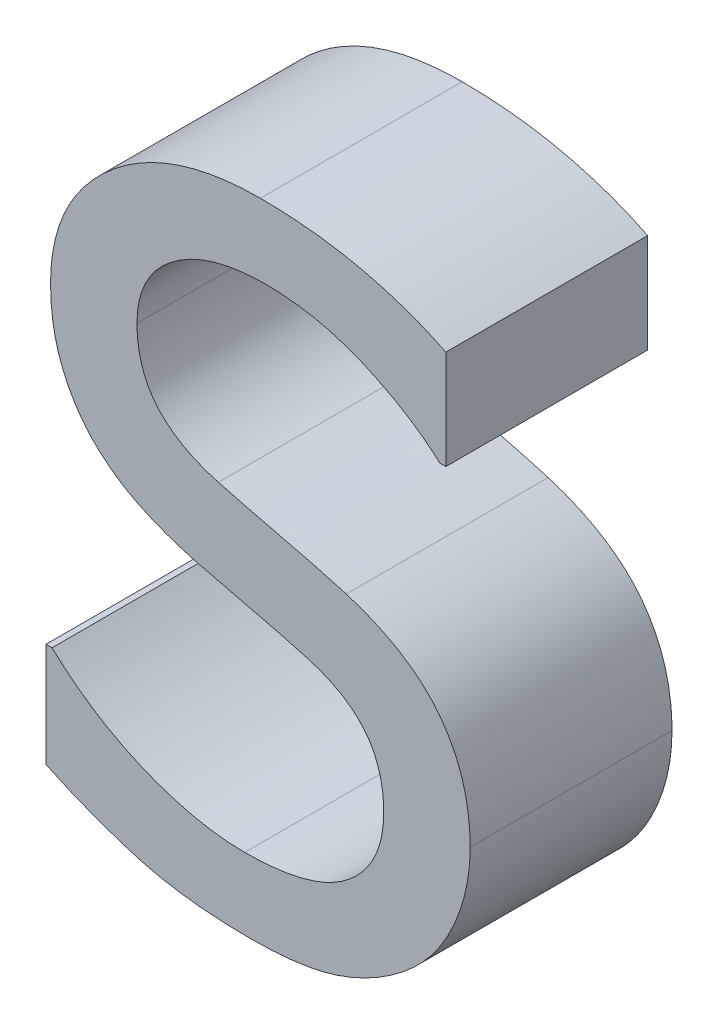
ISO-10303-21;
HEADER;
FILE_DESCRIPTION(('STEP AP214'),'2;1');
FILE_NAME('part.step','',(''),(''),'','','');
FILE_SCHEMA(('AUTOMOTIVE_DESIGN { 1 0 10303 214 1 1 1 1 }'));
ENDSEC;
DATA;
#1=APPLICATION_CONTEXT('core data for automotive mechanical design processes');
#2=APPLICATION_PROTOCOL_DEFINITION('international standard','automotive_design',2000,#1);
#3=PRODUCT_CONTEXT('',#1,'mechanical');
#4=PRODUCT('Part','Part','',(#3));
#5=PRODUCT_RELATED_PRODUCT_CATEGORY('part','',(#4));
#6=PRODUCT_DEFINITION_FORMATION('','',#4);
#7=PRODUCT_DEFINITION_CONTEXT('part definition',#1,'design');
#8=PRODUCT_DEFINITION('design','',#6,#7);
#9=PRODUCT_DEFINITION_SHAPE('','',#8);
#10=(LENGTH_UNIT() NAMED_UNIT(*) SI_UNIT(.MILLI.,.METRE.));
#11=(NAMED_UNIT(*) PLANE_ANGLE_UNIT() SI_UNIT($,.RADIAN.));
#12=(NAMED_UNIT(*) SI_UNIT($,.STERADIAN.) SOLID_ANGLE_UNIT());
#13=UNCERTAINTY_MEASURE_WITH_UNIT(LENGTH_MEASURE(1.E-05),#10,'distance_accuracy_value','');
#14=(GEOMETRIC_REPRESENTATION_CONTEXT(3) GLOBAL_UNCERTAINTY_ASSIGNED_CONTEXT((#13)) GLOBAL_UNIT_ASSIGNED_CONTEXT((#10,
#11,#12)) REPRESENTATION_CONTEXT('',''));
#15=CARTESIAN_POINT('',(0.,0.,0.));
#16=DIRECTION('',(0.,0.,1.));
#17=DIRECTION('',(1.,0.,0.));
#18=AXIS2_PLACEMENT_3D('',#15,#16,#17);
#19=CARTESIAN_POINT('',(-0.859562415474812,-2.871569765799,0.));
#20=DIRECTION('',(-1.,0.,0.));
#21=DIRECTION('',(0.,-1.,0.));
#22=AXIS2_PLACEMENT_3D('',#19,#20,#21);
#23=PLANE('',#22);
#24=DIRECTION('',(0.,1.,0.));
#25=VECTOR('',#24,1.);
#26=CARTESIAN_POINT('',(-0.859562415474812,-2.923170469258,0.));
#27=LINE('',#26,#25);
#28=CARTESIAN_POINT('',(-0.859562415474812,-2.923170469258,0.));
#29=VERTEX_POINT('',#28);
#30=CARTESIAN_POINT('',(-0.859562415474812,-2.871569765799,0.));
#31=VERTEX_POINT('',#30);
#32=EDGE_CURVE('E11',#29,#31,#27,.T.);
#33=ORIENTED_EDGE('',*,*,#32,.F.);
#34=DIRECTION('',(0.,0.,1.));
#35=VECTOR('',#34,1.);
#36=CARTESIAN_POINT('',(-0.859562415474812,-2.923170469258,0.));
#37=LINE('',#36,#35);
#38=CARTESIAN_POINT('',(-0.859562415474812,-2.923170469258,0.1));
#39=VERTEX_POINT('',#38);
#40=EDGE_CURVE('E24',#29,#39,#37,.T.);
#41=ORIENTED_EDGE('',*,*,#40,.T.);
#42=DIRECTION('',(0.,-1.,0.));
#43=VECTOR('',#42,1.);
#44=CARTESIAN_POINT('',(-0.859562415474812,-2.923170469258,0.1));
#45=LINE('',#44,#43);
#46=CARTESIAN_POINT('',(-0.859562415474812,-2.871569765799,0.1));
#47=VERTEX_POINT('',#46);
#48=EDGE_CURVE('E172',#47,#39,#45,.T.);
#49=ORIENTED_EDGE('',*,*,#48,.F.);
#50=DIRECTION('',(0.,0.,1.));
#51=VECTOR('',#50,1.);
#52=CARTESIAN_POINT('',(-0.859562415474812,-2.871569765799,0.));
#53=LINE('',#52,#51);
#54=EDGE_CURVE('E469',#31,#47,#53,.T.);
#55=ORIENTED_EDGE('',*,*,#54,.F.);
#56=EDGE_LOOP('',(#33,#41,#49,#55));
#57=FACE_BOUND('',#56,.T.);
#58=ADVANCED_FACE('F17',(#57),#23,.T.);
#59=CARTESIAN_POINT('',(-0.856556549253876,-2.871569765799,0.));
#60=DIRECTION('',(0.,1.,0.));
#61=DIRECTION('',(-1.,0.,0.));
#62=AXIS2_PLACEMENT_3D('',#59,#60,#61);
#63=PLANE('',#62);
#64=DIRECTION('',(1.,0.,0.));
#65=VECTOR('',#64,1.);
#66=CARTESIAN_POINT('',(-0.859562415474812,-2.871569765799,0.));
#67=LINE('',#66,#65);
#68=CARTESIAN_POINT('',(-0.856556549253876,-2.871569765799,0.));
#69=VERTEX_POINT('',#68);
#70=EDGE_CURVE('E467',#31,#69,#67,.T.);
#71=ORIENTED_EDGE('',*,*,#70,.F.);
#72=ORIENTED_EDGE('',*,*,#54,.T.);
#73=DIRECTION('',(-1.,0.,0.));
#74=VECTOR('',#73,1.);
#75=CARTESIAN_POINT('',(-0.859562415474812,-2.871569765799,0.1));
#76=LINE('',#75,#74);
#77=CARTESIAN_POINT('',(-0.856556549253876,-2.871569765799,0.1));
#78=VERTEX_POINT('',#77);
#79=EDGE_CURVE('E465',#78,#47,#76,.T.);
#80=ORIENTED_EDGE('',*,*,#79,.F.);
#81=DIRECTION('',(0.,0.,1.));
#82=VECTOR('',#81,1.);
#83=CARTESIAN_POINT('',(-0.856556549253876,-2.871569765799,0.));
#84=LINE('',#83,#82);
#85=EDGE_CURVE('E459',#69,#78,#84,.T.);
#86=ORIENTED_EDGE('',*,*,#85,.F.);
#87=EDGE_LOOP('',(#71,#72,#80,#86));
#88=FACE_BOUND('',#87,.T.);
#89=ADVANCED_FACE('F539',(#88),#63,.T.);
#90=CARTESIAN_POINT('',(-0.761120296739145,-2.911647982078,0.));
#91=CARTESIAN_POINT('',(-0.761120296739145,-2.911647982078,0.1));
#92=CARTESIAN_POINT('',(-0.784916737654891,-2.911647982078,0.));
#93=CARTESIAN_POINT('',(-0.784916737654891,-2.911647982078,0.1));
#94=CARTESIAN_POINT('',(-0.836266952262555,-2.890606918531,0.));
#95=CARTESIAN_POINT('',(-0.836266952262555,-2.890606918531,0.1));
#96=CARTESIAN_POINT('',(-0.856556549253876,-2.871569765799,0.));
#97=CARTESIAN_POINT('',(-0.856556549253876,-2.871569765799,0.1));
#98=B_SPLINE_SURFACE_WITH_KNOTS('',2,1,((#90,#91),(#92,#93),(#94,#95),(#96,#97)),.UNSPECIFIED.,
.F.,.F.,.F.,(3,1,3),(2,2),(-2.,-1.,0.),(0.,0.01),.UNSPECIFIED.);
#99=CARTESIAN_POINT('',(-0.856556549253876,-2.871569765799,0.));
#100=CARTESIAN_POINT('',(-0.836266952262555,-2.890606918531,0.));
#101=CARTESIAN_POINT('',(-0.784916737654891,-2.911647982078,0.));
#102=CARTESIAN_POINT('',(-0.761120296739145,-2.911647982078,0.));
#103=B_SPLINE_CURVE_WITH_KNOTS('',2,(#99,#100,#101,#102),.UNSPECIFIED.,.F.,.F.,(3,1,3),(0.,1.,
2.),.UNSPECIFIED.);
#104=CARTESIAN_POINT('',(-0.761120296739145,-2.911647982078,0.));
#105=VERTEX_POINT('',#104);
#106=EDGE_CURVE('E452',#69,#105,#103,.T.);
#107=CARTESIAN_POINT('',(-0.761120296739145,-2.911647982078,0.1));
#108=CARTESIAN_POINT('',(-0.784916737654891,-2.911647982078,0.1));
#109=CARTESIAN_POINT('',(-0.836266952262555,-2.890606918531,0.1));
#110=CARTESIAN_POINT('',(-0.856556549253876,-2.871569765799,0.1));
#111=B_SPLINE_CURVE_WITH_KNOTS('',2,(#107,#108,#109,#110),.UNSPECIFIED.,.F.,.F.,(3,1,3),(-2.,
-1.,0.),.UNSPECIFIED.);
#112=CARTESIAN_POINT('',(-0.761120296739145,-2.911647982078,0.1));
#113=VERTEX_POINT('',#112);
#114=EDGE_CURVE('E447',#113,#78,#111,.T.);
#115=DIRECTION('',(0.,0.,1.));
#116=VECTOR('',#115,1.);
#117=CARTESIAN_POINT('',(-0.761120296739145,-2.911647982078,0.));
#118=LINE('',#117,#116);
#119=EDGE_CURVE('E441',#105,#113,#118,.T.);
#120=ORIENTED_EDGE('',*,*,#106,.F.);
#121=ORIENTED_EDGE('',*,*,#85,.T.);
#122=ORIENTED_EDGE('',*,*,#114,.F.);
#123=ORIENTED_EDGE('',*,*,#119,.F.);
#124=EDGE_LOOP('',(#120,#121,#122,#123));
#125=FACE_BOUND('',#124,.T.);
#126=ADVANCED_FACE('F535',(#125),#98,.T.);
#127=CARTESIAN_POINT('',(-0.692235862509353,-2.860047278619,0.));
#128=CARTESIAN_POINT('',(-0.692235862509353,-2.860047278619,0.1));
#129=CARTESIAN_POINT('',(-0.692235862509353,-2.883342741831,0.));
#130=CARTESIAN_POINT('',(-0.692235862509353,-2.883342741831,0.1));
#131=CARTESIAN_POINT('',(-0.727053812901866,-2.911647982078,0.));
#132=CARTESIAN_POINT('',(-0.727053812901866,-2.911647982078,0.1));
#133=CARTESIAN_POINT('',(-0.761120296739145,-2.911647982078,0.));
#134=CARTESIAN_POINT('',(-0.761120296739145,-2.911647982078,0.1));
#135=B_SPLINE_SURFACE_WITH_KNOTS('',2,1,((#127,#128),(#129,#130),(#131,#132),(#133,#134)),
.UNSPECIFIED.,.F.,.F.,.F.,(3,1,3),(2,2),(-2.,-1.,0.),(0.,0.01),.UNSPECIFIED.);
#136=CARTESIAN_POINT('',(-0.761120296739145,-2.911647982078,0.));
#137=CARTESIAN_POINT('',(-0.727053812901866,-2.911647982078,0.));
#138=CARTESIAN_POINT('',(-0.692235862509353,-2.883342741831,0.));
#139=CARTESIAN_POINT('',(-0.692235862509353,-2.860047278619,0.));
#140=B_SPLINE_CURVE_WITH_KNOTS('',2,(#136,#137,#138,#139),.UNSPECIFIED.,.F.,.F.,(3,1,3),(0.,1.,
2.),.UNSPECIFIED.);
#141=CARTESIAN_POINT('',(-0.692235862509353,-2.860047278619,0.));
#142=VERTEX_POINT('',#141);
#143=EDGE_CURVE('E434',#105,#142,#140,.T.);
#144=CARTESIAN_POINT('',(-0.692235862509353,-2.860047278619,0.1));
#145=CARTESIAN_POINT('',(-0.692235862509353,-2.883342741831,0.1));
#146=CARTESIAN_POINT('',(-0.727053812901866,-2.911647982078,0.1));
#147=CARTESIAN_POINT('',(-0.761120296739145,-2.911647982078,0.1));
#148=B_SPLINE_CURVE_WITH_KNOTS('',2,(#144,#145,#146,#147),.UNSPECIFIED.,.F.,.F.,(3,1,3),(-2.,
-1.,0.),.UNSPECIFIED.);
#149=CARTESIAN_POINT('',(-0.692235862509353,-2.860047278619,0.1));
#150=VERTEX_POINT('',#149);
#151=EDGE_CURVE('E429',#150,#113,#148,.T.);
#152=DIRECTION('',(0.,0.,1.));
#153=VECTOR('',#152,1.);
#154=CARTESIAN_POINT('',(-0.692235862509353,-2.860047278619,0.));
#155=LINE('',#154,#153);
#156=EDGE_CURVE('E423',#142,#150,#155,.T.);
#157=ORIENTED_EDGE('',*,*,#143,.F.);
#158=ORIENTED_EDGE('',*,*,#119,.T.);
#159=ORIENTED_EDGE('',*,*,#151,.F.);
#160=ORIENTED_EDGE('',*,*,#156,.F.);
#161=EDGE_LOOP('',(#157,#158,#159,#160));
#162=FACE_BOUND('',#161,.T.);
#163=ADVANCED_FACE('F531',(#162),#135,.T.);
#164=CARTESIAN_POINT('',(-0.730310167974547,-2.812704885639,0.));
#165=CARTESIAN_POINT('',(-0.730310167974547,-2.812704885639,0.1));
#166=CARTESIAN_POINT('',(-0.710521548686716,-2.818466129229,0.));
#167=CARTESIAN_POINT('',(-0.710521548686716,-2.818466129229,0.1));
#168=CARTESIAN_POINT('',(-0.692235862509353,-2.841511103589,0.));
#169=CARTESIAN_POINT('',(-0.692235862509353,-2.841511103589,0.1));
#170=CARTESIAN_POINT('',(-0.692235862509353,-2.860047278619,0.));
#171=CARTESIAN_POINT('',(-0.692235862509353,-2.860047278619,0.1));
#172=B_SPLINE_SURFACE_WITH_KNOTS('',2,1,((#164,#165),(#166,#167),(#168,#169),(#170,#171)),
.UNSPECIFIED.,.F.,.F.,.F.,(3,1,3),(2,2),(-2.,-1.,0.),(0.,0.01),.UNSPECIFIED.);
#173=CARTESIAN_POINT('',(-0.692235862509353,-2.860047278619,0.));
#174=CARTESIAN_POINT('',(-0.692235862509353,-2.841511103589,0.));
#175=CARTESIAN_POINT('',(-0.710521548686716,-2.818466129229,0.));
#176=CARTESIAN_POINT('',(-0.730310167974547,-2.812704885639,0.));
#177=B_SPLINE_CURVE_WITH_KNOTS('',2,(#173,#174,#175,#176),.UNSPECIFIED.,.F.,.F.,(3,1,3),(0.,1.,
2.),.UNSPECIFIED.);
#178=CARTESIAN_POINT('',(-0.730310167974547,-2.812704885639,0.));
#179=VERTEX_POINT('',#178);
#180=EDGE_CURVE('E416',#142,#179,#177,.T.);
#181=CARTESIAN_POINT('',(-0.730310167974547,-2.812704885639,0.1));
#182=CARTESIAN_POINT('',(-0.710521548686716,-2.818466129229,0.1));
#183=CARTESIAN_POINT('',(-0.692235862509353,-2.841511103589,0.1));
#184=CARTESIAN_POINT('',(-0.692235862509353,-2.860047278619,0.1));
#185=B_SPLINE_CURVE_WITH_KNOTS('',2,(#181,#182,#183,#184),.UNSPECIFIED.,.F.,.F.,(3,1,3),(-2.,
-1.,0.),.UNSPECIFIED.);
#186=CARTESIAN_POINT('',(-0.730310167974547,-2.812704885639,0.1));
#187=VERTEX_POINT('',#186);
#188=EDGE_CURVE('E411',#187,#150,#185,.T.);
#189=DIRECTION('',(0.,0.,1.));
#190=VECTOR('',#189,1.);
#191=CARTESIAN_POINT('',(-0.730310167974547,-2.812704885639,0.));
#192=LINE('',#191,#190);
#193=EDGE_CURVE('E405',#179,#187,#192,.T.);
#194=ORIENTED_EDGE('',*,*,#180,.F.);
#195=ORIENTED_EDGE('',*,*,#156,.T.);
#196=ORIENTED_EDGE('',*,*,#188,.F.);
#197=ORIENTED_EDGE('',*,*,#193,.F.);
#198=EDGE_LOOP('',(#194,#195,#196,#197));
#199=FACE_BOUND('',#198,.T.);
#200=ADVANCED_FACE('F527',(#199),#172,.T.);
#201=CARTESIAN_POINT('',(-0.786169181913615,-2.798677509941,0.));
#202=CARTESIAN_POINT('',(-0.786169181913615,-2.798677509941,0.1));
#203=CARTESIAN_POINT('',(-0.768384473439741,-2.803186309272,0.));
#204=CARTESIAN_POINT('',(-0.768384473439741,-2.803186309272,0.1));
#205=CARTESIAN_POINT('',(-0.744588032523995,-2.808697064011,0.));
#206=CARTESIAN_POINT('',(-0.744588032523995,-2.808697064011,0.1));
#207=CARTESIAN_POINT('',(-0.730310167974547,-2.812704885639,0.));
#208=CARTESIAN_POINT('',(-0.730310167974547,-2.812704885639,0.1));
#209=B_SPLINE_SURFACE_WITH_KNOTS('',2,1,((#201,#202),(#203,#204),(#205,#206),(#207,#208)),
.UNSPECIFIED.,.F.,.F.,.F.,(3,1,3),(2,2),(-2.,-1.,0.),(0.,0.01),.UNSPECIFIED.);
#210=CARTESIAN_POINT('',(-0.730310167974547,-2.812704885639,0.));
#211=CARTESIAN_POINT('',(-0.744588032523995,-2.808697064011,0.));
#212=CARTESIAN_POINT('',(-0.768384473439741,-2.803186309272,0.));
#213=CARTESIAN_POINT('',(-0.786169181913615,-2.798677509941,0.));
#214=B_SPLINE_CURVE_WITH_KNOTS('',2,(#210,#211,#212,#213),.UNSPECIFIED.,.F.,.F.,(3,1,3),(0.,1.,
2.),.UNSPECIFIED.);
#215=CARTESIAN_POINT('',(-0.786169181913615,-2.798677509941,0.));
#216=VERTEX_POINT('',#215);
#217=EDGE_CURVE('E398',#179,#216,#214,.T.);
#218=CARTESIAN_POINT('',(-0.786169181913615,-2.798677509941,0.1));
#219=CARTESIAN_POINT('',(-0.768384473439741,-2.803186309272,0.1));
#220=CARTESIAN_POINT('',(-0.744588032523995,-2.808697064011,0.1));
#221=CARTESIAN_POINT('',(-0.730310167974547,-2.812704885639,0.1));
#222=B_SPLINE_CURVE_WITH_KNOTS('',2,(#218,#219,#220,#221),.UNSPECIFIED.,.F.,.F.,(3,1,3),(-2.,
-1.,0.),.UNSPECIFIED.);
#223=CARTESIAN_POINT('',(-0.786169181913615,-2.798677509941,0.1));
#224=VERTEX_POINT('',#223);
#225=EDGE_CURVE('E393',#224,#187,#222,.T.);
#226=DIRECTION('',(0.,0.,1.));
#227=VECTOR('',#226,1.);
#228=CARTESIAN_POINT('',(-0.786169181913615,-2.798677509941,0.));
#229=LINE('',#228,#227);
#230=EDGE_CURVE('E387',#216,#224,#229,.T.);
#231=ORIENTED_EDGE('',*,*,#217,.F.);
#232=ORIENTED_EDGE('',*,*,#193,.T.);
#233=ORIENTED_EDGE('',*,*,#225,.F.);
#234=ORIENTED_EDGE('',*,*,#230,.F.);
#235=EDGE_LOOP('',(#231,#232,#233,#234));
#236=FACE_BOUND('',#235,.T.);
#237=ADVANCED_FACE('F523',(#236),#209,.T.);
#238=CARTESIAN_POINT('',(-0.837268907669534,-2.771374225101,0.));
#239=CARTESIAN_POINT('',(-0.837268907669534,-2.771374225101,0.1));
#240=CARTESIAN_POINT('',(-0.82749984245149,-2.781644268022,0.));
#241=CARTESIAN_POINT('',(-0.82749984245149,-2.781644268022,0.1));
#242=CARTESIAN_POINT('',(-0.802200468425276,-2.794419199461,0.));
#243=CARTESIAN_POINT('',(-0.802200468425276,-2.794419199461,0.1));
#244=CARTESIAN_POINT('',(-0.786169181913615,-2.798677509941,0.));
#245=CARTESIAN_POINT('',(-0.786169181913615,-2.798677509941,0.1));
#246=B_SPLINE_SURFACE_WITH_KNOTS('',2,1,((#238,#239),(#240,#241),(#242,#243),(#244,#245)),
.UNSPECIFIED.,.F.,.F.,.F.,(3,1,3),(2,2),(-2.,-1.,0.),(0.,0.01),.UNSPECIFIED.);
#247=CARTESIAN_POINT('',(-0.786169181913615,-2.798677509941,0.));
#248=CARTESIAN_POINT('',(-0.802200468425276,-2.794419199461,0.));
#249=CARTESIAN_POINT('',(-0.82749984245149,-2.781644268022,0.));
#250=CARTESIAN_POINT('',(-0.837268907669534,-2.771374225101,0.));
#251=B_SPLINE_CURVE_WITH_KNOTS('',2,(#247,#248,#249,#250),.UNSPECIFIED.,.F.,.F.,(3,1,3),(0.,1.,
2.),.UNSPECIFIED.);
#252=CARTESIAN_POINT('',(-0.837268907669534,-2.771374225101,0.));
#253=VERTEX_POINT('',#252);
#254=EDGE_CURVE('E380',#216,#253,#251,.T.);
#255=CARTESIAN_POINT('',(-0.837268907669534,-2.771374225101,0.1));
#256=CARTESIAN_POINT('',(-0.82749984245149,-2.781644268022,0.1));
#257=CARTESIAN_POINT('',(-0.802200468425276,-2.794419199461,0.1));
#258=CARTESIAN_POINT('',(-0.786169181913615,-2.798677509941,0.1));
#259=B_SPLINE_CURVE_WITH_KNOTS('',2,(#255,#256,#257,#258),.UNSPECIFIED.,.F.,.F.,(3,1,3),(-2.,
-1.,0.),.UNSPECIFIED.);
#260=CARTESIAN_POINT('',(-0.837268907669534,-2.771374225101,0.1));
#261=VERTEX_POINT('',#260);
#262=EDGE_CURVE('E375',#261,#224,#259,.T.);
#263=DIRECTION('',(0.,0.,1.));
#264=VECTOR('',#263,1.);
#265=CARTESIAN_POINT('',(-0.837268907669534,-2.771374225101,0.));
#266=LINE('',#265,#264);
#267=EDGE_CURVE('E369',#253,#261,#266,.T.);
#268=ORIENTED_EDGE('',*,*,#254,.F.);
#269=ORIENTED_EDGE('',*,*,#230,.T.);
#270=ORIENTED_EDGE('',*,*,#262,.F.);
#271=ORIENTED_EDGE('',*,*,#267,.F.);
#272=EDGE_LOOP('',(#268,#269,#270,#271));
#273=FACE_BOUND('',#272,.T.);
#274=ADVANCED_FACE('F519',(#273),#246,.T.);
#275=CARTESIAN_POINT('',(-0.85730801580911,-2.715515211162,0.));
#276=CARTESIAN_POINT('',(-0.85730801580911,-2.715515211162,0.1));
#277=CARTESIAN_POINT('',(-0.85730801580911,-2.733550408487,0.));
#278=CARTESIAN_POINT('',(-0.85730801580911,-2.733550408487,0.1));
#279=CARTESIAN_POINT('',(-0.846787484035832,-2.761104182179,0.));
#280=CARTESIAN_POINT('',(-0.846787484035832,-2.761104182179,0.1));
#281=CARTESIAN_POINT('',(-0.837268907669534,-2.771374225101,0.));
#282=CARTESIAN_POINT('',(-0.837268907669534,-2.771374225101,0.1));
#283=B_SPLINE_SURFACE_WITH_KNOTS('',2,1,((#275,#276),(#277,#278),(#279,#280),(#281,#282)),
.UNSPECIFIED.,.F.,.F.,.F.,(3,1,3),(2,2),(-2.,-1.,0.),(0.,0.01),.UNSPECIFIED.);
#284=CARTESIAN_POINT('',(-0.837268907669534,-2.771374225101,0.));
#285=CARTESIAN_POINT('',(-0.846787484035832,-2.761104182179,0.));
#286=CARTESIAN_POINT('',(-0.85730801580911,-2.733550408487,0.));
#287=CARTESIAN_POINT('',(-0.85730801580911,-2.715515211162,0.));
#288=B_SPLINE_CURVE_WITH_KNOTS('',2,(#284,#285,#286,#287),.UNSPECIFIED.,.F.,.F.,(3,1,3),(0.,1.,
2.),.UNSPECIFIED.);
#289=CARTESIAN_POINT('',(-0.85730801580911,-2.715515211162,0.));
#290=VERTEX_POINT('',#289);
#291=EDGE_CURVE('E362',#253,#290,#288,.T.);
#292=CARTESIAN_POINT('',(-0.85730801580911,-2.715515211162,0.1));
#293=CARTESIAN_POINT('',(-0.85730801580911,-2.733550408487,0.1));
#294=CARTESIAN_POINT('',(-0.846787484035832,-2.761104182179,0.1));
#295=CARTESIAN_POINT('',(-0.837268907669534,-2.771374225101,0.1));
#296=B_SPLINE_CURVE_WITH_KNOTS('',2,(#292,#293,#294,#295),.UNSPECIFIED.,.F.,.F.,(3,1,3),(-2.,
-1.,0.),.UNSPECIFIED.);
#297=CARTESIAN_POINT('',(-0.85730801580911,-2.715515211162,0.1));
#298=VERTEX_POINT('',#297);
#299=EDGE_CURVE('E357',#298,#261,#296,.T.);
#300=DIRECTION('',(0.,0.,1.));
#301=VECTOR('',#300,1.);
#302=CARTESIAN_POINT('',(-0.85730801580911,-2.715515211162,0.));
#303=LINE('',#302,#301);
#304=EDGE_CURVE('E351',#290,#298,#303,.T.);
#305=ORIENTED_EDGE('',*,*,#291,.F.);
#306=ORIENTED_EDGE('',*,*,#267,.T.);
#307=ORIENTED_EDGE('',*,*,#299,.F.);
#308=ORIENTED_EDGE('',*,*,#304,.F.);
#309=EDGE_LOOP('',(#305,#306,#307,#308));
#310=FACE_BOUND('',#309,.T.);
#311=ADVANCED_FACE('F515',(#310),#283,.T.);
#312=CARTESIAN_POINT('',(-0.753355142335059,-2.627092646496,0.));
#313=CARTESIAN_POINT('',(-0.753355142335059,-2.627092646496,0.1));
#314=CARTESIAN_POINT('',(-0.79869362450085,-2.627092646496,0.));
#315=CARTESIAN_POINT('',(-0.79869362450085,-2.627092646496,0.1));
#316=CARTESIAN_POINT('',(-0.85730801580911,-2.6779418834,0.));
#317=CARTESIAN_POINT('',(-0.85730801580911,-2.6779418834,0.1));
#318=CARTESIAN_POINT('',(-0.85730801580911,-2.715515211162,0.));
#319=CARTESIAN_POINT('',(-0.85730801580911,-2.715515211162,0.1));
#320=B_SPLINE_SURFACE_WITH_KNOTS('',2,1,((#312,#313),(#314,#315),(#316,#317),(#318,#319)),
.UNSPECIFIED.,.F.,.F.,.F.,(3,1,3),(2,2),(-2.,-1.,0.),(0.,0.01),.UNSPECIFIED.);
#321=CARTESIAN_POINT('',(-0.85730801580911,-2.715515211162,0.));
#322=CARTESIAN_POINT('',(-0.85730801580911,-2.6779418834,0.));
#323=CARTESIAN_POINT('',(-0.79869362450085,-2.627092646496,0.));
#324=CARTESIAN_POINT('',(-0.753355142335059,-2.627092646496,0.));
#325=B_SPLINE_CURVE_WITH_KNOTS('',2,(#321,#322,#323,#324),.UNSPECIFIED.,.F.,.F.,(3,1,3),(0.,1.,
2.),.UNSPECIFIED.);
#326=CARTESIAN_POINT('',(-0.753355142335059,-2.627092646496,0.));
#327=VERTEX_POINT('',#326);
#328=EDGE_CURVE('E344',#290,#327,#325,.T.);
#329=CARTESIAN_POINT('',(-0.753355142335059,-2.627092646496,0.1));
#330=CARTESIAN_POINT('',(-0.79869362450085,-2.627092646496,0.1));
#331=CARTESIAN_POINT('',(-0.85730801580911,-2.6779418834,0.1));
#332=CARTESIAN_POINT('',(-0.85730801580911,-2.715515211162,0.1));
#333=B_SPLINE_CURVE_WITH_KNOTS('',2,(#329,#330,#331,#332),.UNSPECIFIED.,.F.,.F.,(3,1,3),(-2.,
-1.,0.),.UNSPECIFIED.);
#334=CARTESIAN_POINT('',(-0.753355142335059,-2.627092646496,0.1));
#335=VERTEX_POINT('',#334);
#336=EDGE_CURVE('E339',#335,#298,#333,.T.);
#337=DIRECTION('',(0.,0.,1.));
#338=VECTOR('',#337,1.);
#339=CARTESIAN_POINT('',(-0.753355142335059,-2.627092646496,0.));
#340=LINE('',#339,#338);
#341=EDGE_CURVE('E333',#327,#335,#340,.T.);
#342=ORIENTED_EDGE('',*,*,#328,.F.);
#343=ORIENTED_EDGE('',*,*,#304,.T.);
#344=ORIENTED_EDGE('',*,*,#336,.F.);
#345=ORIENTED_EDGE('',*,*,#341,.F.);
#346=EDGE_LOOP('',(#342,#343,#344,#345));
#347=FACE_BOUND('',#346,.T.);
#348=ADVANCED_FACE('F511',(#347),#320,.T.);
#349=CARTESIAN_POINT('',(-0.661425733744754,-2.647131754636,0.));
#350=CARTESIAN_POINT('',(-0.661425733744754,-2.647131754636,0.1));
#351=CARTESIAN_POINT('',(-0.681214353032586,-2.637362689417,0.));
#352=CARTESIAN_POINT('',(-0.681214353032586,-2.637362689417,0.1));
#353=CARTESIAN_POINT('',(-0.727304301753611,-2.627092646496,0.));
#354=CARTESIAN_POINT('',(-0.727304301753611,-2.627092646496,0.1));
#355=CARTESIAN_POINT('',(-0.753355142335059,-2.627092646496,0.));
#356=CARTESIAN_POINT('',(-0.753355142335059,-2.627092646496,0.1));
#357=B_SPLINE_SURFACE_WITH_KNOTS('',2,1,((#349,#350),(#351,#352),(#353,#354),(#355,#356)),
.UNSPECIFIED.,.F.,.F.,.F.,(3,1,3),(2,2),(-2.,-1.,0.),(0.,0.01),.UNSPECIFIED.);
#358=CARTESIAN_POINT('',(-0.753355142335059,-2.627092646496,0.));
#359=CARTESIAN_POINT('',(-0.727304301753611,-2.627092646496,0.));
#360=CARTESIAN_POINT('',(-0.681214353032586,-2.637362689417,0.));
#361=CARTESIAN_POINT('',(-0.661425733744754,-2.647131754636,0.));
#362=B_SPLINE_CURVE_WITH_KNOTS('',2,(#358,#359,#360,#361),.UNSPECIFIED.,.F.,.F.,(3,1,3),(0.,1.,
2.),.UNSPECIFIED.);
#363=CARTESIAN_POINT('',(-0.661425733744754,-2.647131754636,0.));
#364=VERTEX_POINT('',#363);
#365=EDGE_CURVE('E326',#327,#364,#362,.T.);
#366=CARTESIAN_POINT('',(-0.661425733744754,-2.647131754636,0.1));
#367=CARTESIAN_POINT('',(-0.681214353032586,-2.637362689417,0.1));
#368=CARTESIAN_POINT('',(-0.727304301753611,-2.627092646496,0.1));
#369=CARTESIAN_POINT('',(-0.753355142335059,-2.627092646496,0.1));
#370=B_SPLINE_CURVE_WITH_KNOTS('',2,(#366,#367,#368,#369),.UNSPECIFIED.,.F.,.F.,(3,1,3),(-2.,
-1.,0.),.UNSPECIFIED.);
#371=CARTESIAN_POINT('',(-0.661425733744754,-2.647131754636,0.1));
#372=VERTEX_POINT('',#371);
#373=EDGE_CURVE('E321',#372,#335,#370,.T.);
#374=DIRECTION('',(0.,0.,1.));
#375=VECTOR('',#374,1.);
#376=CARTESIAN_POINT('',(-0.661425733744754,-2.647131754636,0.));
#377=LINE('',#376,#375);
#378=EDGE_CURVE('E318',#364,#372,#377,.T.);
#379=ORIENTED_EDGE('',*,*,#365,.F.);
#380=ORIENTED_EDGE('',*,*,#341,.T.);
#381=ORIENTED_EDGE('',*,*,#373,.F.);
#382=ORIENTED_EDGE('',*,*,#378,.F.);
#383=EDGE_LOOP('',(#379,#380,#381,#382));
#384=FACE_BOUND('',#383,.T.);
#385=ADVANCED_FACE('F507',(#384),#357,.T.);
#386=CARTESIAN_POINT('',(-0.661425733744754,-2.696227569577,0.));
#387=DIRECTION('',(1.,0.,0.));
#388=DIRECTION('',(0.,1.,0.));
#389=AXIS2_PLACEMENT_3D('',#386,#387,#388);
#390=PLANE('',#389);
#391=DIRECTION('',(0.,-1.,0.));
#392=VECTOR('',#391,1.);
#393=CARTESIAN_POINT('',(-0.661425733744754,-2.647131754636,0.));
#394=LINE('',#393,#392);
#395=CARTESIAN_POINT('',(-0.661425733744754,-2.696227569577,0.));
#396=VERTEX_POINT('',#395);
#397=EDGE_CURVE('E316',#364,#396,#394,.T.);
#398=ORIENTED_EDGE('',*,*,#397,.F.);
#399=ORIENTED_EDGE('',*,*,#378,.T.);
#400=DIRECTION('',(0.,1.,0.));
#401=VECTOR('',#400,1.);
#402=CARTESIAN_POINT('',(-0.661425733744754,-2.647131754636,0.1));
#403=LINE('',#402,#401);
#404=CARTESIAN_POINT('',(-0.661425733744754,-2.696227569577,0.1));
#405=VERTEX_POINT('',#404);
#406=EDGE_CURVE('E313',#405,#372,#403,.T.);
#407=ORIENTED_EDGE('',*,*,#406,.F.);
#408=DIRECTION('',(0.,0.,1.));
#409=VECTOR('',#408,1.);
#410=CARTESIAN_POINT('',(-0.661425733744754,-2.696227569577,0.));
#411=LINE('',#410,#409);
#412=EDGE_CURVE('E310',#396,#405,#411,.T.);
#413=ORIENTED_EDGE('',*,*,#412,.F.);
#414=EDGE_LOOP('',(#398,#399,#407,#413));
#415=FACE_BOUND('',#414,.T.);
#416=ADVANCED_FACE('F503',(#415),#390,.T.);
#417=CARTESIAN_POINT('',(-0.664431599965691,-2.696227569577,0.));
#418=DIRECTION('',(0.,-1.,0.));
#419=DIRECTION('',(1.,0.,0.));
#420=AXIS2_PLACEMENT_3D('',#417,#418,#419);
#421=PLANE('',#420);
#422=DIRECTION('',(-1.,0.,0.));
#423=VECTOR('',#422,1.);
#424=CARTESIAN_POINT('',(-0.661425733744754,-2.696227569577,0.));
#425=LINE('',#424,#423);
#426=CARTESIAN_POINT('',(-0.664431599965691,-2.696227569577,0.));
#427=VERTEX_POINT('',#426);
#428=EDGE_CURVE('E308',#396,#427,#425,.T.);
#429=ORIENTED_EDGE('',*,*,#428,.F.);
#430=ORIENTED_EDGE('',*,*,#412,.T.);
#431=DIRECTION('',(1.,0.,0.));
#432=VECTOR('',#431,1.);
#433=CARTESIAN_POINT('',(-0.661425733744754,-2.696227569577,0.1));
#434=LINE('',#433,#432);
#435=CARTESIAN_POINT('',(-0.664431599965691,-2.696227569577,0.1));
#436=VERTEX_POINT('',#435);
#437=EDGE_CURVE('E305',#436,#405,#434,.T.);
#438=ORIENTED_EDGE('',*,*,#437,.F.);
#439=DIRECTION('',(0.,0.,1.));
#440=VECTOR('',#439,1.);
#441=CARTESIAN_POINT('',(-0.664431599965691,-2.696227569577,0.));
#442=LINE('',#441,#440);
#443=EDGE_CURVE('E299',#427,#436,#442,.T.);
#444=ORIENTED_EDGE('',*,*,#443,.F.);
#445=EDGE_LOOP('',(#429,#430,#438,#444));
#446=FACE_BOUND('',#445,.T.);
#447=ADVANCED_FACE('F499',(#446),#421,.T.);
#448=CARTESIAN_POINT('',(-0.750599764965868,-2.662662063444,0.));
#449=CARTESIAN_POINT('',(-0.750599764965868,-2.662662063444,0.1));
#450=CARTESIAN_POINT('',(-0.725300390939653,-2.662662063444,0.));
#451=CARTESIAN_POINT('',(-0.725300390939653,-2.662662063444,0.1));
#452=CARTESIAN_POINT('',(-0.679210442218628,-2.682701171583,0.));
#453=CARTESIAN_POINT('',(-0.679210442218628,-2.682701171583,0.1));
#454=CARTESIAN_POINT('',(-0.664431599965691,-2.696227569577,0.));
#455=CARTESIAN_POINT('',(-0.664431599965691,-2.696227569577,0.1));
#456=B_SPLINE_SURFACE_WITH_KNOTS('',2,1,((#448,#449),(#450,#451),(#452,#453),(#454,#455)),
.UNSPECIFIED.,.F.,.F.,.F.,(3,1,3),(2,2),(-2.,-1.,0.),(0.,0.01),.UNSPECIFIED.);
#457=CARTESIAN_POINT('',(-0.664431599965691,-2.696227569577,0.));
#458=CARTESIAN_POINT('',(-0.679210442218628,-2.682701171583,0.));
#459=CARTESIAN_POINT('',(-0.725300390939653,-2.662662063444,0.));
#460=CARTESIAN_POINT('',(-0.750599764965868,-2.662662063444,0.));
#461=B_SPLINE_CURVE_WITH_KNOTS('',2,(#457,#458,#459,#460),.UNSPECIFIED.,.F.,.F.,(3,1,3),(0.,1.,
2.),.UNSPECIFIED.);
#462=CARTESIAN_POINT('',(-0.750599764965868,-2.662662063444,0.));
#463=VERTEX_POINT('',#462);
#464=EDGE_CURVE('E292',#427,#463,#461,.T.);
#465=CARTESIAN_POINT('',(-0.750599764965868,-2.662662063444,0.1));
#466=CARTESIAN_POINT('',(-0.725300390939653,-2.662662063444,0.1));
#467=CARTESIAN_POINT('',(-0.679210442218628,-2.682701171583,0.1));
#468=CARTESIAN_POINT('',(-0.664431599965691,-2.696227569577,0.1));
#469=B_SPLINE_CURVE_WITH_KNOTS('',2,(#465,#466,#467,#468),.UNSPECIFIED.,.F.,.F.,(3,1,3),(-2.,
-1.,0.),.UNSPECIFIED.);
#470=CARTESIAN_POINT('',(-0.750599764965868,-2.662662063444,0.1));
#471=VERTEX_POINT('',#470);
#472=EDGE_CURVE('E287',#471,#436,#469,.T.);
#473=DIRECTION('',(0.,0.,1.));
#474=VECTOR('',#473,1.);
#475=CARTESIAN_POINT('',(-0.750599764965868,-2.662662063444,0.));
#476=LINE('',#475,#474);
#477=EDGE_CURVE('E281',#463,#471,#476,.T.);
#478=ORIENTED_EDGE('',*,*,#464,.F.);
#479=ORIENTED_EDGE('',*,*,#443,.T.);
#480=ORIENTED_EDGE('',*,*,#472,.F.);
#481=ORIENTED_EDGE('',*,*,#477,.F.);
#482=EDGE_LOOP('',(#478,#479,#480,#481));
#483=FACE_BOUND('',#482,.T.);
#484=ADVANCED_FACE('F495',(#483),#456,.T.);
#485=CARTESIAN_POINT('',(-0.814474422160766,-2.711256900682,0.));
#486=CARTESIAN_POINT('',(-0.814474422160766,-2.711256900682,0.1));
#487=CARTESIAN_POINT('',(-0.814474422160766,-2.68946437058,0.));
#488=CARTESIAN_POINT('',(-0.814474422160766,-2.68946437058,0.1));
#489=CARTESIAN_POINT('',(-0.779155494064763,-2.662662063444,0.));
#490=CARTESIAN_POINT('',(-0.779155494064763,-2.662662063444,0.1));
#491=CARTESIAN_POINT('',(-0.750599764965868,-2.662662063444,0.));
#492=CARTESIAN_POINT('',(-0.750599764965868,-2.662662063444,0.1));
#493=B_SPLINE_SURFACE_WITH_KNOTS('',2,1,((#485,#486),(#487,#488),(#489,#490),(#491,#492)),
.UNSPECIFIED.,.F.,.F.,.F.,(3,1,3),(2,2),(-2.,-1.,0.),(0.,0.01),.UNSPECIFIED.);
#494=CARTESIAN_POINT('',(-0.750599764965868,-2.662662063444,0.));
#495=CARTESIAN_POINT('',(-0.779155494064763,-2.662662063444,0.));
#496=CARTESIAN_POINT('',(-0.814474422160766,-2.68946437058,0.));
#497=CARTESIAN_POINT('',(-0.814474422160766,-2.711256900682,0.));
#498=B_SPLINE_CURVE_WITH_KNOTS('',2,(#494,#495,#496,#497),.UNSPECIFIED.,.F.,.F.,(3,1,3),(0.,1.,
2.),.UNSPECIFIED.);
#499=CARTESIAN_POINT('',(-0.814474422160766,-2.711256900682,0.));
#500=VERTEX_POINT('',#499);
#501=EDGE_CURVE('E274',#463,#500,#498,.T.);
#502=CARTESIAN_POINT('',(-0.814474422160766,-2.711256900682,0.1));
#503=CARTESIAN_POINT('',(-0.814474422160766,-2.68946437058,0.1));
#504=CARTESIAN_POINT('',(-0.779155494064763,-2.662662063444,0.1));
#505=CARTESIAN_POINT('',(-0.750599764965868,-2.662662063444,0.1));
#506=B_SPLINE_CURVE_WITH_KNOTS('',2,(#502,#503,#504,#505),.UNSPECIFIED.,.F.,.F.,(3,1,3),(-2.,
-1.,0.),.UNSPECIFIED.);
#507=CARTESIAN_POINT('',(-0.814474422160766,-2.711256900682,0.1));
#508=VERTEX_POINT('',#507);
#509=EDGE_CURVE('E269',#508,#471,#506,.T.);
#510=DIRECTION('',(0.,0.,1.));
#511=VECTOR('',#510,1.);
#512=CARTESIAN_POINT('',(-0.814474422160766,-2.711256900682,0.));
#513=LINE('',#512,#511);
#514=EDGE_CURVE('E263',#500,#508,#513,.T.);
#515=ORIENTED_EDGE('',*,*,#501,.F.);
#516=ORIENTED_EDGE('',*,*,#477,.T.);
#517=ORIENTED_EDGE('',*,*,#509,.F.);
#518=ORIENTED_EDGE('',*,*,#514,.F.);
#519=EDGE_LOOP('',(#515,#516,#517,#518));
#520=FACE_BOUND('',#519,.T.);
#521=ADVANCED_FACE('F491',(#520),#493,.T.);
#522=CARTESIAN_POINT('',(-0.774145717029869,-2.759350760217,0.));
#523=CARTESIAN_POINT('',(-0.774145717029869,-2.759350760217,0.1));
#524=CARTESIAN_POINT('',(-0.793683847465956,-2.75409049433,0.));
#525=CARTESIAN_POINT('',(-0.793683847465956,-2.75409049433,0.1));
#526=CARTESIAN_POINT('',(-0.814474422160766,-2.730795031118,0.));
#527=CARTESIAN_POINT('',(-0.814474422160766,-2.730795031118,0.1));
#528=CARTESIAN_POINT('',(-0.814474422160766,-2.711256900682,0.));
#529=CARTESIAN_POINT('',(-0.814474422160766,-2.711256900682,0.1));
#530=B_SPLINE_SURFACE_WITH_KNOTS('',2,1,((#522,#523),(#524,#525),(#526,#527),(#528,#529)),
.UNSPECIFIED.,.F.,.F.,.F.,(3,1,3),(2,2),(-2.,-1.,0.),(0.,0.01),.UNSPECIFIED.);
#531=CARTESIAN_POINT('',(-0.814474422160766,-2.711256900682,0.));
#532=CARTESIAN_POINT('',(-0.814474422160766,-2.730795031118,0.));
#533=CARTESIAN_POINT('',(-0.793683847465956,-2.75409049433,0.));
#534=CARTESIAN_POINT('',(-0.774145717029869,-2.759350760217,0.));
#535=B_SPLINE_CURVE_WITH_KNOTS('',2,(#531,#532,#533,#534),.UNSPECIFIED.,.F.,.F.,(3,1,3),(0.,1.,
2.),.UNSPECIFIED.);
#536=CARTESIAN_POINT('',(-0.774145717029869,-2.759350760217,0.));
#537=VERTEX_POINT('',#536);
#538=EDGE_CURVE('E255',#500,#537,#535,.T.);
#539=CARTESIAN_POINT('',(-0.774145717029869,-2.759350760217,0.1));
#540=CARTESIAN_POINT('',(-0.793683847465956,-2.75409049433,0.1));
#541=CARTESIAN_POINT('',(-0.814474422160766,-2.730795031118,0.1));
#542=CARTESIAN_POINT('',(-0.814474422160766,-2.711256900682,0.1));
#543=B_SPLINE_CURVE_WITH_KNOTS('',2,(#539,#540,#541,#542),.UNSPECIFIED.,.F.,.F.,(3,1,3),(-2.,
-1.,0.),.UNSPECIFIED.);
#544=CARTESIAN_POINT('',(-0.774145717029869,-2.759350760217,0.1));
#545=VERTEX_POINT('',#544);
#546=EDGE_CURVE('E250',#545,#508,#543,.T.);
#547=DIRECTION('',(0.,0.,1.));
#548=VECTOR('',#547,1.);
#549=CARTESIAN_POINT('',(-0.774145717029869,-2.759350760217,0.));
#550=LINE('',#549,#548);
#551=EDGE_CURVE('E245',#537,#545,#550,.T.);
#552=ORIENTED_EDGE('',*,*,#538,.F.);
#553=ORIENTED_EDGE('',*,*,#514,.T.);
#554=ORIENTED_EDGE('',*,*,#546,.F.);
#555=ORIENTED_EDGE('',*,*,#551,.F.);
#556=EDGE_LOOP('',(#552,#553,#554,#555));
#557=FACE_BOUND('',#556,.T.);
#558=ADVANCED_FACE('F487',(#557),#530,.T.);
#559=CARTESIAN_POINT('',(-0.71077203753846,-2.775632535581,0.));
#560=CARTESIAN_POINT('',(-0.71077203753846,-2.775632535581,0.1));
#561=CARTESIAN_POINT('',(-0.723296480125695,-2.771875202804,0.));
#562=CARTESIAN_POINT('',(-0.723296480125695,-2.771875202804,0.1));
#563=CARTESIAN_POINT('',(-0.761120296739145,-2.762857604142,0.));
#564=CARTESIAN_POINT('',(-0.761120296739145,-2.762857604142,0.1));
#565=CARTESIAN_POINT('',(-0.774145717029869,-2.759350760217,0.));
#566=CARTESIAN_POINT('',(-0.774145717029869,-2.759350760217,0.1));
#567=B_SPLINE_SURFACE_WITH_KNOTS('',2,1,((#559,#560),(#561,#562),(#563,#564),(#565,#566)),
.UNSPECIFIED.,.F.,.F.,.F.,(3,1,3),(2,2),(-2.,-1.,0.),(0.,0.01),.UNSPECIFIED.);
#568=CARTESIAN_POINT('',(-0.774145717029869,-2.759350760217,0.));
#569=CARTESIAN_POINT('',(-0.761120296739145,-2.762857604142,0.));
#570=CARTESIAN_POINT('',(-0.723296480125695,-2.771875202804,0.));
#571=CARTESIAN_POINT('',(-0.71077203753846,-2.775632535581,0.));
#572=B_SPLINE_CURVE_WITH_KNOTS('',2,(#568,#569,#570,#571),.UNSPECIFIED.,.F.,.F.,(3,1,3),(0.,1.,
2.),.UNSPECIFIED.);
#573=CARTESIAN_POINT('',(-0.710772037538461,-2.775632535581,0.));
#574=VERTEX_POINT('',#573);
#575=EDGE_CURVE('E238',#537,#574,#572,.T.);
#576=CARTESIAN_POINT('',(-0.71077203753846,-2.775632535581,0.1));
#577=CARTESIAN_POINT('',(-0.723296480125695,-2.771875202804,0.1));
#578=CARTESIAN_POINT('',(-0.761120296739145,-2.762857604142,0.1));
#579=CARTESIAN_POINT('',(-0.774145717029869,-2.759350760217,0.1));
#580=B_SPLINE_CURVE_WITH_KNOTS('',2,(#576,#577,#578,#579),.UNSPECIFIED.,.F.,.F.,(3,1,3),(-2.,
-1.,0.),.UNSPECIFIED.);
#581=CARTESIAN_POINT('',(-0.710772037538461,-2.775632535581,0.1));
#582=VERTEX_POINT('',#581);
#583=EDGE_CURVE('E233',#582,#545,#580,.T.);
#584=DIRECTION('',(0.,0.,1.));
#585=VECTOR('',#584,1.);
#586=CARTESIAN_POINT('',(-0.710772037538461,-2.775632535581,0.));
#587=LINE('',#586,#585);
#588=EDGE_CURVE('E227',#574,#582,#587,.T.);
#589=ORIENTED_EDGE('',*,*,#575,.F.);
#590=ORIENTED_EDGE('',*,*,#551,.T.);
#591=ORIENTED_EDGE('',*,*,#583,.F.);
#592=ORIENTED_EDGE('',*,*,#588,.F.);
#593=EDGE_LOOP('',(#589,#590,#591,#592));
#594=FACE_BOUND('',#593,.T.);
#595=ADVANCED_FACE('F484',(#594),#567,.T.);
#596=CARTESIAN_POINT('',(-0.649402268861009,-2.853534568473,0.));
#597=CARTESIAN_POINT('',(-0.649402268861009,-2.853534568473,0.1));
#598=CARTESIAN_POINT('',(-0.649402268861009,-2.824728350523,0.));
#599=CARTESIAN_POINT('',(-0.649402268861009,-2.824728350523,0.1));
#600=CARTESIAN_POINT('',(-0.678959953366883,-2.785401600799,0.));
#601=CARTESIAN_POINT('',(-0.678959953366883,-2.785401600799,0.1));
#602=CARTESIAN_POINT('',(-0.71077203753846,-2.775632535581,0.));
#603=CARTESIAN_POINT('',(-0.71077203753846,-2.775632535581,0.1));
#604=B_SPLINE_SURFACE_WITH_KNOTS('',2,1,((#596,#597),(#598,#599),(#600,#601),(#602,#603)),
.UNSPECIFIED.,.F.,.F.,.F.,(3,1,3),(2,2),(-2.,-1.,0.),(0.,0.01),.UNSPECIFIED.);
#605=CARTESIAN_POINT('',(-0.71077203753846,-2.775632535581,0.));
#606=CARTESIAN_POINT('',(-0.678959953366883,-2.785401600799,0.));
#607=CARTESIAN_POINT('',(-0.649402268861009,-2.824728350523,0.));
#608=CARTESIAN_POINT('',(-0.649402268861009,-2.853534568473,0.));
#609=B_SPLINE_CURVE_WITH_KNOTS('',2,(#605,#606,#607,#608),.UNSPECIFIED.,.F.,.F.,(3,1,3),(0.,1.,
2.),.UNSPECIFIED.);
#610=CARTESIAN_POINT('',(-0.649402268861009,-2.853534568473,0.));
#611=VERTEX_POINT('',#610);
#612=EDGE_CURVE('E220',#574,#611,#609,.T.);
#613=CARTESIAN_POINT('',(-0.649402268861009,-2.853534568473,0.1));
#614=CARTESIAN_POINT('',(-0.649402268861009,-2.824728350523,0.1));
#615=CARTESIAN_POINT('',(-0.678959953366883,-2.785401600799,0.1));
#616=CARTESIAN_POINT('',(-0.71077203753846,-2.775632535581,0.1));
#617=B_SPLINE_CURVE_WITH_KNOTS('',2,(#613,#614,#615,#616),.UNSPECIFIED.,.F.,.F.,(3,1,3),(-2.,
-1.,0.),.UNSPECIFIED.);
#618=CARTESIAN_POINT('',(-0.649402268861009,-2.853534568473,0.1));
#619=VERTEX_POINT('',#618);
#620=EDGE_CURVE('E215',#619,#582,#617,.T.);
#621=DIRECTION('',(0.,0.,1.));
#622=VECTOR('',#621,1.);
#623=CARTESIAN_POINT('',(-0.649402268861009,-2.853534568473,0.));
#624=LINE('',#623,#622);
#625=EDGE_CURVE('E209',#611,#619,#624,.T.);
#626=ORIENTED_EDGE('',*,*,#612,.F.);
#627=ORIENTED_EDGE('',*,*,#588,.T.);
#628=ORIENTED_EDGE('',*,*,#620,.F.);
#629=ORIENTED_EDGE('',*,*,#625,.F.);
#630=EDGE_LOOP('',(#626,#627,#628,#629));
#631=FACE_BOUND('',#630,.T.);
#632=ADVANCED_FACE('F480',(#631),#604,.T.);
#633=CARTESIAN_POINT('',(-0.677457020256415,-2.91916264763,0.));
#634=CARTESIAN_POINT('',(-0.677457020256415,-2.91916264763,0.1));
#635=CARTESIAN_POINT('',(-0.664181111113946,-2.906888693895,0.));
#636=CARTESIAN_POINT('',(-0.664181111113946,-2.906888693895,0.1));
#637=CARTESIAN_POINT('',(-0.649402268861009,-2.87182025465,0.));
#638=CARTESIAN_POINT('',(-0.649402268861009,-2.87182025465,0.1));
#639=CARTESIAN_POINT('',(-0.649402268861009,-2.853534568473,0.));
#640=CARTESIAN_POINT('',(-0.649402268861009,-2.853534568473,0.1));
#641=B_SPLINE_SURFACE_WITH_KNOTS('',2,1,((#633,#634),(#635,#636),(#637,#638),(#639,#640)),
.UNSPECIFIED.,.F.,.F.,.F.,(3,1,3),(2,2),(-2.,-1.,0.),(0.,0.01),.UNSPECIFIED.);
#642=CARTESIAN_POINT('',(-0.649402268861009,-2.853534568473,0.));
#643=CARTESIAN_POINT('',(-0.649402268861009,-2.87182025465,0.));
#644=CARTESIAN_POINT('',(-0.664181111113946,-2.906888693895,0.));
#645=CARTESIAN_POINT('',(-0.677457020256415,-2.91916264763,0.));
#646=B_SPLINE_CURVE_WITH_KNOTS('',2,(#642,#643,#644,#645),.UNSPECIFIED.,.F.,.F.,(3,1,3),(0.,1.,
2.),.UNSPECIFIED.);
#647=CARTESIAN_POINT('',(-0.677457020256415,-2.91916264763,0.));
#648=VERTEX_POINT('',#647);
#649=EDGE_CURVE('E202',#611,#648,#646,.T.);
#650=CARTESIAN_POINT('',(-0.677457020256415,-2.91916264763,0.1));
#651=CARTESIAN_POINT('',(-0.664181111113946,-2.906888693895,0.1));
#652=CARTESIAN_POINT('',(-0.649402268861009,-2.87182025465,0.1));
#653=CARTESIAN_POINT('',(-0.649402268861009,-2.853534568473,0.1));
#654=B_SPLINE_CURVE_WITH_KNOTS('',2,(#650,#651,#652,#653),.UNSPECIFIED.,.F.,.F.,(3,1,3),(-2.,
-1.,0.),.UNSPECIFIED.);
#655=CARTESIAN_POINT('',(-0.677457020256415,-2.91916264763,0.1));
#656=VERTEX_POINT('',#655);
#657=EDGE_CURVE('E198',#656,#619,#654,.T.);
#658=DIRECTION('',(0.,0.,1.));
#659=VECTOR('',#658,1.);
#660=CARTESIAN_POINT('',(-0.677457020256415,-2.91916264763,0.));
#661=LINE('',#660,#659);
#662=EDGE_CURVE('E157',#648,#656,#661,.T.);
#663=ORIENTED_EDGE('',*,*,#649,.F.);
#664=ORIENTED_EDGE('',*,*,#625,.T.);
#665=ORIENTED_EDGE('',*,*,#657,.F.);
#666=ORIENTED_EDGE('',*,*,#662,.F.);
#667=EDGE_LOOP('',(#663,#664,#665,#666));
#668=FACE_BOUND('',#667,.T.);
#669=ADVANCED_FACE('F477',(#668),#641,.T.);
#670=CARTESIAN_POINT('',(-0.758114430518209,-2.947217399026,0.));
#671=CARTESIAN_POINT('',(-0.758114430518209,-2.947217399026,0.1));
#672=CARTESIAN_POINT('',(-0.729809190271058,-2.947217399026,0.));
#673=CARTESIAN_POINT('',(-0.729809190271058,-2.947217399026,0.1));
#674=CARTESIAN_POINT('',(-0.692235862509353,-2.932689045624,0.));
#675=CARTESIAN_POINT('',(-0.692235862509353,-2.932689045624,0.1));
#676=CARTESIAN_POINT('',(-0.677457020256415,-2.91916264763,0.));
#677=CARTESIAN_POINT('',(-0.677457020256415,-2.91916264763,0.1));
#678=B_SPLINE_SURFACE_WITH_KNOTS('',2,1,((#670,#671),(#672,#673),(#674,#675),(#676,#677)),
.UNSPECIFIED.,.F.,.F.,.F.,(3,1,3),(2,2),(-2.,-1.,0.),(0.,0.01),.UNSPECIFIED.);
#679=CARTESIAN_POINT('',(-0.677457020256415,-2.91916264763,0.));
#680=CARTESIAN_POINT('',(-0.692235862509353,-2.932689045624,0.));
#681=CARTESIAN_POINT('',(-0.729809190271058,-2.947217399026,0.));
#682=CARTESIAN_POINT('',(-0.758114430518209,-2.947217399026,0.));
#683=B_SPLINE_CURVE_WITH_KNOTS('',2,(#679,#680,#681,#682),.UNSPECIFIED.,.F.,.F.,(3,1,3),(0.,1.,
2.),.UNSPECIFIED.);
#684=CARTESIAN_POINT('',(-0.758114430518209,-2.947217399026,0.));
#685=VERTEX_POINT('',#684);
#686=EDGE_CURVE('E161',#648,#685,#683,.T.);
#687=CARTESIAN_POINT('',(-0.758114430518209,-2.947217399026,0.1));
#688=CARTESIAN_POINT('',(-0.729809190271058,-2.947217399026,0.1));
#689=CARTESIAN_POINT('',(-0.692235862509353,-2.932689045624,0.1));
#690=CARTESIAN_POINT('',(-0.677457020256415,-2.91916264763,0.1));
#691=B_SPLINE_CURVE_WITH_KNOTS('',2,(#687,#688,#689,#690),.UNSPECIFIED.,.F.,.F.,(3,1,3),(-2.,
-1.,0.),.UNSPECIFIED.);
#692=CARTESIAN_POINT('',(-0.758114430518209,-2.947217399026,0.1));
#693=VERTEX_POINT('',#692);
#694=EDGE_CURVE('E150',#693,#656,#691,.T.);
#695=DIRECTION('',(0.,0.,1.));
#696=VECTOR('',#695,1.);
#697=CARTESIAN_POINT('',(-0.758114430518209,-2.947217399026,0.));
#698=LINE('',#697,#696);
#699=EDGE_CURVE('E154',#685,#693,#698,.T.);
#700=ORIENTED_EDGE('',*,*,#686,.F.);
#701=ORIENTED_EDGE('',*,*,#662,.T.);
#702=ORIENTED_EDGE('',*,*,#694,.F.);
#703=ORIENTED_EDGE('',*,*,#699,.F.);
#704=EDGE_LOOP('',(#700,#701,#702,#703));
#705=FACE_BOUND('',#704,.T.);
#706=ADVANCED_FACE('F153',(#705),#678,.T.);
#707=CARTESIAN_POINT('',(-0.859562415474812,-2.923170469258,0.));
#708=CARTESIAN_POINT('',(-0.859562415474812,-2.923170469258,0.1));
#709=CARTESIAN_POINT('',(-0.838771840780002,-2.933190023328,0.));
#710=CARTESIAN_POINT('',(-0.838771840780002,-2.933190023328,0.1));
#711=CARTESIAN_POINT('',(-0.791679936651998,-2.947217399026,0.));
#712=CARTESIAN_POINT('',(-0.791679936651998,-2.947217399026,0.1));
#713=CARTESIAN_POINT('',(-0.758114430518209,-2.947217399026,0.));
#714=CARTESIAN_POINT('',(-0.758114430518209,-2.947217399026,0.1));
#715=B_SPLINE_SURFACE_WITH_KNOTS('',2,1,((#707,#708),(#709,#710),(#711,#712),(#713,#714)),
.UNSPECIFIED.,.F.,.F.,.F.,(3,1,3),(2,2),(-2.,-1.,0.),(0.,0.01),.UNSPECIFIED.);
#716=CARTESIAN_POINT('',(-0.758114430518209,-2.947217399026,0.));
#717=CARTESIAN_POINT('',(-0.791679936651998,-2.947217399026,0.));
#718=CARTESIAN_POINT('',(-0.838771840780002,-2.933190023328,0.));
#719=CARTESIAN_POINT('',(-0.859562415474812,-2.923170469258,0.));
#720=B_SPLINE_CURVE_WITH_KNOTS('',2,(#716,#717,#718,#719),.UNSPECIFIED.,.F.,.F.,(3,1,3),(0.,1.,
2.),.UNSPECIFIED.);
#721=EDGE_CURVE('E167',#685,#29,#720,.T.);
#722=CARTESIAN_POINT('',(-0.859562415474812,-2.923170469258,0.1));
#723=CARTESIAN_POINT('',(-0.838771840780002,-2.933190023328,0.1));
#724=CARTESIAN_POINT('',(-0.791679936651998,-2.947217399026,0.1));
#725=CARTESIAN_POINT('',(-0.758114430518209,-2.947217399026,0.1));
#726=B_SPLINE_CURVE_WITH_KNOTS('',2,(#722,#723,#724,#725),.UNSPECIFIED.,.F.,.F.,(3,1,3),(-2.,
-1.,0.),.UNSPECIFIED.);
#727=EDGE_CURVE('E166',#39,#693,#726,.T.);
#728=ORIENTED_EDGE('',*,*,#721,.F.);
#729=ORIENTED_EDGE('',*,*,#699,.T.);
#730=ORIENTED_EDGE('',*,*,#727,.F.);
#731=ORIENTED_EDGE('',*,*,#40,.F.);
#732=EDGE_LOOP('',(#728,#729,#730,#731));
#733=FACE_BOUND('',#732,.T.);
#734=ADVANCED_FACE('F165',(#733),#715,.T.);
#735=CARTESIAN_POINT('',(-0.756091429219103,-2.789232960025,0.));
#736=DIRECTION('',(0.,0.,1.));
#737=DIRECTION('',(1.,0.,0.));
#738=AXIS2_PLACEMENT_3D('',#735,#736,#737);
#739=PLANE('',#738);
#740=ORIENTED_EDGE('',*,*,#721,.T.);
#741=ORIENTED_EDGE('',*,*,#32,.T.);
#742=ORIENTED_EDGE('',*,*,#70,.T.);
#743=ORIENTED_EDGE('',*,*,#106,.T.);
#744=ORIENTED_EDGE('',*,*,#143,.T.);
#745=ORIENTED_EDGE('',*,*,#180,.T.);
#746=ORIENTED_EDGE('',*,*,#217,.T.);
#747=ORIENTED_EDGE('',*,*,#254,.T.);
#748=ORIENTED_EDGE('',*,*,#291,.T.);
#749=ORIENTED_EDGE('',*,*,#328,.T.);
#750=ORIENTED_EDGE('',*,*,#365,.T.);
#751=ORIENTED_EDGE('',*,*,#397,.T.);
#752=ORIENTED_EDGE('',*,*,#428,.T.);
#753=ORIENTED_EDGE('',*,*,#464,.T.);
#754=ORIENTED_EDGE('',*,*,#501,.T.);
#755=ORIENTED_EDGE('',*,*,#538,.T.);
#756=ORIENTED_EDGE('',*,*,#575,.T.);
#757=ORIENTED_EDGE('',*,*,#612,.T.);
#758=ORIENTED_EDGE('',*,*,#649,.T.);
#759=ORIENTED_EDGE('',*,*,#686,.T.);
#760=EDGE_LOOP('',(#740,#741,#742,#743,#744,#745,#746,#747,#748,#749,#750,#751,#752,#753,#754,
#755,#756,#757,#758,#759));
#761=FACE_BOUND('',#760,.T.);
#762=ADVANCED_FACE('F472',(#761),#739,.F.);
#763=CARTESIAN_POINT('',(-0.756091429219103,-2.789232960025,0.1));
#764=DIRECTION('',(0.,0.,1.));
#765=DIRECTION('',(1.,0.,0.));
#766=AXIS2_PLACEMENT_3D('',#763,#764,#765);
#767=PLANE('',#766);
#768=ORIENTED_EDGE('',*,*,#727,.T.);
#769=ORIENTED_EDGE('',*,*,#694,.T.);
#770=ORIENTED_EDGE('',*,*,#657,.T.);
#771=ORIENTED_EDGE('',*,*,#620,.T.);
#772=ORIENTED_EDGE('',*,*,#583,.T.);
#773=ORIENTED_EDGE('',*,*,#546,.T.);
#774=ORIENTED_EDGE('',*,*,#509,.T.);
#775=ORIENTED_EDGE('',*,*,#472,.T.);
#776=ORIENTED_EDGE('',*,*,#437,.T.);
#777=ORIENTED_EDGE('',*,*,#406,.T.);
#778=ORIENTED_EDGE('',*,*,#373,.T.);
#779=ORIENTED_EDGE('',*,*,#336,.T.);
#780=ORIENTED_EDGE('',*,*,#299,.T.);
#781=ORIENTED_EDGE('',*,*,#262,.T.);
#782=ORIENTED_EDGE('',*,*,#225,.T.);
#783=ORIENTED_EDGE('',*,*,#188,.T.);
#784=ORIENTED_EDGE('',*,*,#151,.T.);
#785=ORIENTED_EDGE('',*,*,#114,.T.);
#786=ORIENTED_EDGE('',*,*,#79,.T.);
#787=ORIENTED_EDGE('',*,*,#48,.T.);
#788=EDGE_LOOP('',(#768,#769,#770,#771,#772,#773,#774,#775,#776,#777,#778,#779,#780,#781,#782,
#783,#784,#785,#786,#787));
#789=FACE_BOUND('',#788,.T.);
#790=ADVANCED_FACE('F170',(#789),#767,.T.);
#791=CLOSED_SHELL('',(#58,#89,#126,#163,#200,#237,#274,#311,#348,#385,#416,#447,#484,#521,#558,
#595,#632,#669,#706,#734,#762,#790));
#792=MANIFOLD_SOLID_BREP('B1',#791);
#793=ADVANCED_BREP_SHAPE_REPRESENTATION('',(#18,#792),#14);
#794=SHAPE_DEFINITION_REPRESENTATION(#9,#793);
ENDSEC;
END-ISO-10303-21;
